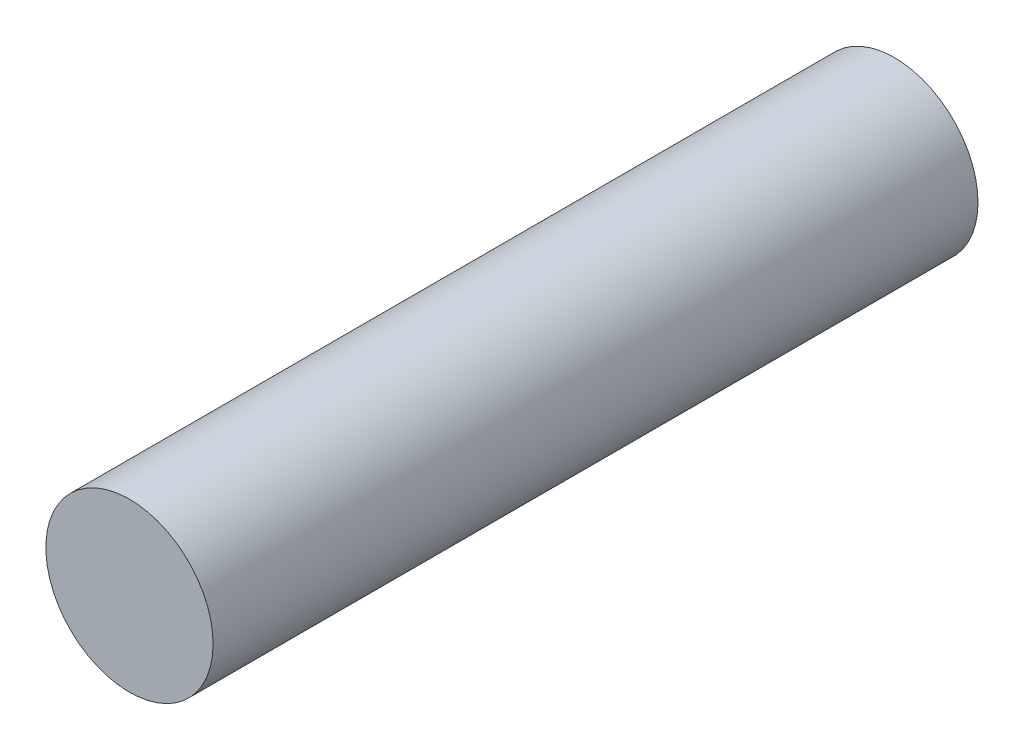
ISO-10303-21;
HEADER;
FILE_DESCRIPTION(('STEP AP214'),'2;1');
FILE_NAME('part.step','',(''),(''),'','','');
FILE_SCHEMA(('AUTOMOTIVE_DESIGN { 1 0 10303 214 1 1 1 1 }'));
ENDSEC;
DATA;
#1=APPLICATION_CONTEXT('core data for automotive mechanical design processes');
#2=APPLICATION_PROTOCOL_DEFINITION('international standard','automotive_design',2000,#1);
#3=PRODUCT_CONTEXT('',#1,'mechanical');
#4=PRODUCT('Part','Part','',(#3));
#5=PRODUCT_RELATED_PRODUCT_CATEGORY('part','',(#4));
#6=PRODUCT_DEFINITION_FORMATION('','',#4);
#7=PRODUCT_DEFINITION_CONTEXT('part definition',#1,'design');
#8=PRODUCT_DEFINITION('design','',#6,#7);
#9=PRODUCT_DEFINITION_SHAPE('','',#8);
#10=(LENGTH_UNIT() NAMED_UNIT(*) SI_UNIT(.MILLI.,.METRE.));
#11=(NAMED_UNIT(*) PLANE_ANGLE_UNIT() SI_UNIT($,.RADIAN.));
#12=(NAMED_UNIT(*) SI_UNIT($,.STERADIAN.) SOLID_ANGLE_UNIT());
#13=UNCERTAINTY_MEASURE_WITH_UNIT(LENGTH_MEASURE(1.E-05),#10,'distance_accuracy_value','');
#14=(GEOMETRIC_REPRESENTATION_CONTEXT(3) GLOBAL_UNCERTAINTY_ASSIGNED_CONTEXT((#13)) GLOBAL_UNIT_ASSIGNED_CONTEXT((#10,
#11,#12)) REPRESENTATION_CONTEXT('',''));
#15=CARTESIAN_POINT('',(0.,0.,0.));
#16=DIRECTION('',(0.,0.,1.));
#17=DIRECTION('',(1.,0.,0.));
#18=AXIS2_PLACEMENT_3D('',#15,#16,#17);
#19=CARTESIAN_POINT('',(0.,0.,30.));
#20=DIRECTION('',(0.,0.,-1.));
#21=DIRECTION('',(-1.,0.,0.));
#22=AXIS2_PLACEMENT_3D('',#19,#20,#21);
#23=CYLINDRICAL_SURFACE('',#22,3.27958777805485);
#24=CARTESIAN_POINT('',(0.,0.,30.));
#25=DIRECTION('',(0.,0.,1.));
#26=DIRECTION('',(1.,0.,0.));
#27=AXIS2_PLACEMENT_3D('',#24,#25,#26);
#28=CIRCLE('',#27,3.27958777805485);
#29=CARTESIAN_POINT('',(3.27958777805485,0.,30.));
#30=VERTEX_POINT('',#29);
#31=EDGE_CURVE('E10',#30,#30,#28,.T.);
#32=ORIENTED_EDGE('',*,*,#31,.F.);
#33=EDGE_LOOP('',(#32));
#34=FACE_BOUND('',#33,.T.);
#35=CARTESIAN_POINT('',(0.,0.,0.));
#36=DIRECTION('',(0.,0.,1.));
#37=DIRECTION('',(1.,0.,0.));
#38=AXIS2_PLACEMENT_3D('',#35,#36,#37);
#39=CIRCLE('',#38,3.27958777805485);
#40=CARTESIAN_POINT('',(3.27958777805485,0.,0.));
#41=VERTEX_POINT('',#40);
#42=EDGE_CURVE('E40',#41,#41,#39,.T.);
#43=ORIENTED_EDGE('',*,*,#42,.T.);
#44=EDGE_LOOP('',(#43));
#45=FACE_BOUND('',#44,.T.);
#46=ADVANCED_FACE('F37',(#34,#45),#23,.T.);
#47=CARTESIAN_POINT('',(0.,0.,30.));
#48=DIRECTION('',(0.,0.,1.));
#49=DIRECTION('',(1.,0.,0.));
#50=AXIS2_PLACEMENT_3D('',#47,#48,#49);
#51=PLANE('',#50);
#52=ORIENTED_EDGE('',*,*,#31,.T.);
#53=EDGE_LOOP('',(#52));
#54=FACE_BOUND('',#53,.T.);
#55=ADVANCED_FACE('F54',(#54),#51,.T.);
#56=CARTESIAN_POINT('',(0.,0.,0.));
#57=DIRECTION('',(0.,0.,1.));
#58=DIRECTION('',(1.,0.,0.));
#59=AXIS2_PLACEMENT_3D('',#56,#57,#58);
#60=PLANE('',#59);
#61=ORIENTED_EDGE('',*,*,#42,.F.);
#62=EDGE_LOOP('',(#61));
#63=FACE_BOUND('',#62,.T.);
#64=ADVANCED_FACE('F52',(#63),#60,.F.);
#65=CLOSED_SHELL('',(#46,#55,#64));
#66=MANIFOLD_SOLID_BREP('B2',#65);
#67=ADVANCED_BREP_SHAPE_REPRESENTATION('',(#18,#66),#14);
#68=SHAPE_DEFINITION_REPRESENTATION(#9,#67);
ENDSEC;
END-ISO-10303-21;
